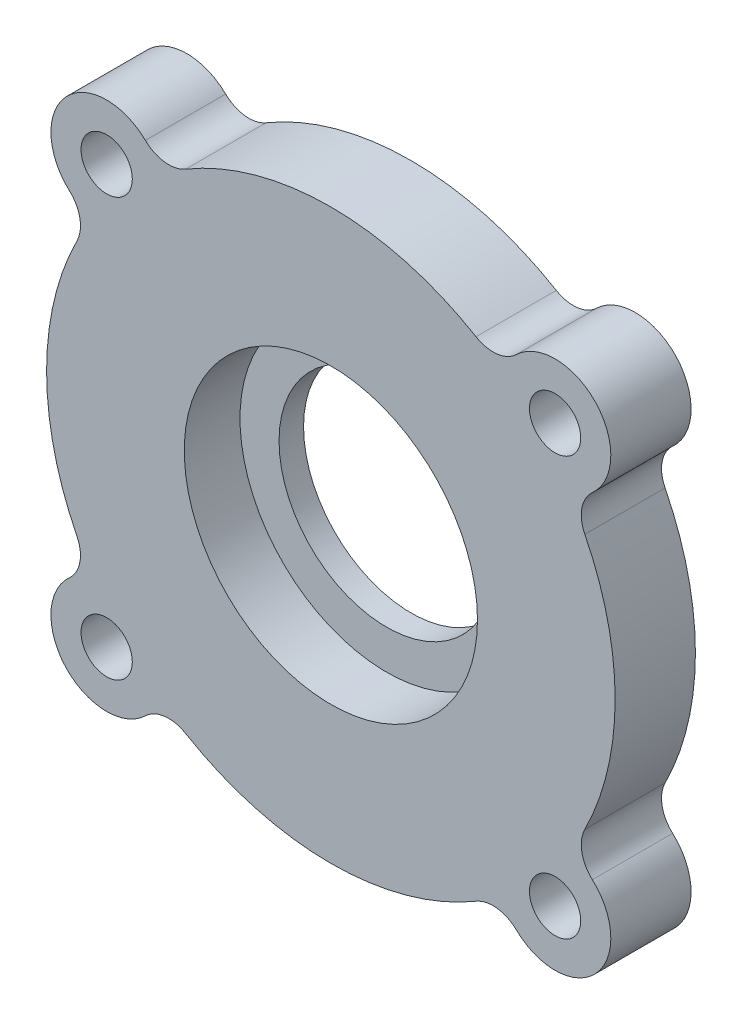
ISO-10303-21;
HEADER;
FILE_DESCRIPTION(('STEP AP214'),'2;1');
FILE_NAME('part.step','',(''),(''),'','','');
FILE_SCHEMA(('AUTOMOTIVE_DESIGN { 1 0 10303 214 1 1 1 1 }'));
ENDSEC;
DATA;
#1=APPLICATION_CONTEXT('core data for automotive mechanical design processes');
#2=APPLICATION_PROTOCOL_DEFINITION('international standard','automotive_design',2000,#1);
#3=PRODUCT_CONTEXT('',#1,'mechanical');
#4=PRODUCT('Part','Part','',(#3));
#5=PRODUCT_RELATED_PRODUCT_CATEGORY('part','',(#4));
#6=PRODUCT_DEFINITION_FORMATION('','',#4);
#7=PRODUCT_DEFINITION_CONTEXT('part definition',#1,'design');
#8=PRODUCT_DEFINITION('design','',#6,#7);
#9=PRODUCT_DEFINITION_SHAPE('','',#8);
#10=(LENGTH_UNIT() NAMED_UNIT(*) SI_UNIT(.MILLI.,.METRE.));
#11=(NAMED_UNIT(*) PLANE_ANGLE_UNIT() SI_UNIT($,.RADIAN.));
#12=(NAMED_UNIT(*) SI_UNIT($,.STERADIAN.) SOLID_ANGLE_UNIT());
#13=UNCERTAINTY_MEASURE_WITH_UNIT(LENGTH_MEASURE(1.E-05),#10,'distance_accuracy_value','');
#14=(GEOMETRIC_REPRESENTATION_CONTEXT(3) GLOBAL_UNCERTAINTY_ASSIGNED_CONTEXT((#13)) GLOBAL_UNIT_ASSIGNED_CONTEXT((#10,
#11,#12)) REPRESENTATION_CONTEXT('',''));
#15=CARTESIAN_POINT('',(0.,0.,0.));
#16=DIRECTION('',(0.,0.,1.));
#17=DIRECTION('',(1.,0.,0.));
#18=AXIS2_PLACEMENT_3D('',#15,#16,#17);
#19=CARTESIAN_POINT('',(0.,0.,7.2));
#20=DIRECTION('',(0.,0.,-1.));
#21=DIRECTION('',(-1.,0.,0.));
#22=AXIS2_PLACEMENT_3D('',#19,#20,#21);
#23=CYLINDRICAL_SURFACE('',#22,9.65);
#24=CARTESIAN_POINT('',(0.,0.,0.));
#25=DIRECTION('',(0.,0.,1.));
#26=DIRECTION('',(1.,0.,0.));
#27=AXIS2_PLACEMENT_3D('',#24,#25,#26);
#28=CIRCLE('',#27,9.65);
#29=CARTESIAN_POINT('',(9.65,0.,0.));
#30=VERTEX_POINT('',#29);
#31=EDGE_CURVE('E184',#30,#30,#28,.T.);
#32=ORIENTED_EDGE('',*,*,#31,.F.);
#33=EDGE_LOOP('',(#32));
#34=FACE_BOUND('',#33,.T.);
#35=CARTESIAN_POINT('',(0.,0.,2.2));
#36=DIRECTION('',(0.,0.,1.));
#37=DIRECTION('',(1.,0.,0.));
#38=AXIS2_PLACEMENT_3D('',#35,#36,#37);
#39=CIRCLE('',#38,9.65);
#40=CARTESIAN_POINT('',(9.65,0.,2.2));
#41=VERTEX_POINT('',#40);
#42=EDGE_CURVE('E37',#41,#41,#39,.T.);
#43=ORIENTED_EDGE('',*,*,#42,.T.);
#44=EDGE_LOOP('',(#43));
#45=FACE_BOUND('',#44,.T.);
#46=ADVANCED_FACE('F33',(#34,#45),#23,.F.);
#47=CARTESIAN_POINT('',(7.27538154217382,-12.2528087969982,7.2));
#48=DIRECTION('',(0.,0.,1.));
#49=DIRECTION('',(1.,0.,0.));
#50=AXIS2_PLACEMENT_3D('',#47,#48,#49);
#51=PLANE('',#50);
#52=CARTESIAN_POINT('',(0.,0.,7.2));
#53=DIRECTION('',(0.,0.,1.));
#54=DIRECTION('',(1.,0.,0.));
#55=AXIS2_PLACEMENT_3D('',#52,#53,#54);
#56=CIRCLE('',#55,13.15);
#57=CARTESIAN_POINT('',(13.15,0.,7.2));
#58=VERTEX_POINT('',#57);
#59=EDGE_CURVE('E457',#58,#58,#56,.T.);
#60=ORIENTED_EDGE('',*,*,#59,.F.);
#61=EDGE_LOOP('',(#60));
#62=FACE_BOUND('',#61,.T.);
#63=CARTESIAN_POINT('',(20.1122267945272,18.7549549017186,7.2));
#64=DIRECTION('',(0.,0.,1.));
#65=DIRECTION('',(1.,0.,0.));
#66=AXIS2_PLACEMENT_3D('',#63,#64,#65);
#67=CIRCLE('',#66,2.3);
#68=CARTESIAN_POINT('',(22.4122267945272,18.7549549017186,7.2));
#69=VERTEX_POINT('',#68);
#70=EDGE_CURVE('E469',#69,#69,#67,.T.);
#71=ORIENTED_EDGE('',*,*,#70,.F.);
#72=EDGE_LOOP('',(#71));
#73=FACE_BOUND('',#72,.T.);
#74=CARTESIAN_POINT('',(-20.1122267945272,-18.7549549017187,7.2));
#75=DIRECTION('',(0.,0.,1.));
#76=DIRECTION('',(1.,0.,0.));
#77=AXIS2_PLACEMENT_3D('',#74,#75,#76);
#78=CIRCLE('',#77,2.3);
#79=CARTESIAN_POINT('',(-17.8122267945272,-18.7549549017187,7.2));
#80=VERTEX_POINT('',#79);
#81=EDGE_CURVE('E481',#80,#80,#78,.T.);
#82=ORIENTED_EDGE('',*,*,#81,.F.);
#83=EDGE_LOOP('',(#82));
#84=FACE_BOUND('',#83,.T.);
#85=CARTESIAN_POINT('',(14.5507630843476,-24.5056175939964,7.2));
#86=DIRECTION('',(0.,0.,-1.));
#87=DIRECTION('',(1.,0.,0.));
#88=AXIS2_PLACEMENT_3D('',#85,#86,#87);
#89=CIRCLE('',#88,3.);
#90=CARTESIAN_POINT('',(13.019103812311,-21.9260788998915,7.2));
#91=VERTEX_POINT('',#90);
#92=CARTESIAN_POINT('',(16.636311975665,-22.3491190843922,7.2));
#93=VERTEX_POINT('',#92);
#94=EDGE_CURVE('E211',#91,#93,#89,.T.);
#95=ORIENTED_EDGE('',*,*,#94,.T.);
#96=CARTESIAN_POINT('',(20.1122267945272,-18.7549549017186,7.2));
#97=DIRECTION('',(0.,0.,1.));
#98=DIRECTION('',(1.,0.,0.));
#99=AXIS2_PLACEMENT_3D('',#96,#97,#98);
#100=CIRCLE('',#99,5.);
#101=CARTESIAN_POINT('',(23.4551682130951,-15.0367910172155,7.2));
#102=VERTEX_POINT('',#101);
#103=EDGE_CURVE('E118',#93,#102,#100,.T.);
#104=ORIENTED_EDGE('',*,*,#103,.T.);
#105=CARTESIAN_POINT('',(25.4609330642358,-12.8058926865136,7.2));
#106=DIRECTION('',(0.,0.,-1.));
#107=DIRECTION('',(1.,0.,0.));
#108=AXIS2_PLACEMENT_3D('',#105,#106,#107);
#109=CIRCLE('',#108,3.);
#110=CARTESIAN_POINT('',(22.7808348469478,-11.4579039826701,7.2));
#111=VERTEX_POINT('',#110);
#112=EDGE_CURVE('E251',#102,#111,#109,.T.);
#113=ORIENTED_EDGE('',*,*,#112,.T.);
#114=CARTESIAN_POINT('',(0.,0.,7.2));
#115=DIRECTION('',(0.,0.,1.));
#116=DIRECTION('',(1.,0.,0.));
#117=AXIS2_PLACEMENT_3D('',#114,#115,#116);
#118=CIRCLE('',#117,25.5);
#119=CARTESIAN_POINT('',(22.7808348469478,11.4579039826701,7.2));
#120=VERTEX_POINT('',#119);
#121=EDGE_CURVE('E270',#111,#120,#118,.T.);
#122=ORIENTED_EDGE('',*,*,#121,.T.);
#123=CARTESIAN_POINT('',(25.4609330642358,12.8058926865136,7.2));
#124=DIRECTION('',(0.,0.,-1.));
#125=DIRECTION('',(1.,0.,0.));
#126=AXIS2_PLACEMENT_3D('',#123,#124,#125);
#127=CIRCLE('',#126,3.);
#128=CARTESIAN_POINT('',(23.4551682130951,15.0367910172155,7.2));
#129=VERTEX_POINT('',#128);
#130=EDGE_CURVE('E267',#120,#129,#127,.T.);
#131=ORIENTED_EDGE('',*,*,#130,.T.);
#132=CARTESIAN_POINT('',(20.1122267945272,18.7549549017186,7.2));
#133=DIRECTION('',(0.,0.,1.));
#134=DIRECTION('',(1.,0.,0.));
#135=AXIS2_PLACEMENT_3D('',#132,#133,#134);
#136=CIRCLE('',#135,5.);
#137=CARTESIAN_POINT('',(16.636311975665,22.3491190843922,7.2));
#138=VERTEX_POINT('',#137);
#139=EDGE_CURVE('E269',#129,#138,#136,.T.);
#140=ORIENTED_EDGE('',*,*,#139,.T.);
#141=CARTESIAN_POINT('',(14.5507630843476,24.5056175939964,7.2));
#142=DIRECTION('',(0.,0.,-1.));
#143=DIRECTION('',(1.,0.,0.));
#144=AXIS2_PLACEMENT_3D('',#141,#142,#143);
#145=CIRCLE('',#144,3.);
#146=CARTESIAN_POINT('',(13.019103812311,21.9260788998915,7.2));
#147=VERTEX_POINT('',#146);
#148=EDGE_CURVE('E272',#138,#147,#145,.T.);
#149=ORIENTED_EDGE('',*,*,#148,.T.);
#150=CARTESIAN_POINT('',(0.,0.,7.2));
#151=DIRECTION('',(0.,0.,1.));
#152=DIRECTION('',(1.,0.,0.));
#153=AXIS2_PLACEMENT_3D('',#150,#151,#152);
#154=CIRCLE('',#153,25.5);
#155=CARTESIAN_POINT('',(-13.019103812311,21.9260788998915,7.2));
#156=VERTEX_POINT('',#155);
#157=EDGE_CURVE('E278',#147,#156,#154,.T.);
#158=ORIENTED_EDGE('',*,*,#157,.T.);
#159=CARTESIAN_POINT('',(-14.5507630843476,24.5056175939964,7.2));
#160=DIRECTION('',(0.,0.,-1.));
#161=DIRECTION('',(1.,0.,0.));
#162=AXIS2_PLACEMENT_3D('',#159,#160,#161);
#163=CIRCLE('',#162,3.);
#164=CARTESIAN_POINT('',(-16.636311975665,22.3491190843922,7.2));
#165=VERTEX_POINT('',#164);
#166=EDGE_CURVE('E280',#156,#165,#163,.T.);
#167=ORIENTED_EDGE('',*,*,#166,.T.);
#168=CARTESIAN_POINT('',(-20.1122267945272,18.7549549017187,7.2));
#169=DIRECTION('',(0.,0.,1.));
#170=DIRECTION('',(1.,0.,0.));
#171=AXIS2_PLACEMENT_3D('',#168,#169,#170);
#172=CIRCLE('',#171,5.);
#173=CARTESIAN_POINT('',(-23.4551682130951,15.0367910172155,7.2));
#174=VERTEX_POINT('',#173);
#175=EDGE_CURVE('E282',#165,#174,#172,.T.);
#176=ORIENTED_EDGE('',*,*,#175,.T.);
#177=CARTESIAN_POINT('',(-25.4609330642358,12.8058926865136,7.2));
#178=DIRECTION('',(0.,0.,-1.));
#179=DIRECTION('',(1.,0.,0.));
#180=AXIS2_PLACEMENT_3D('',#177,#178,#179);
#181=CIRCLE('',#180,3.);
#182=CARTESIAN_POINT('',(-22.7808348469478,11.4579039826701,7.2));
#183=VERTEX_POINT('',#182);
#184=EDGE_CURVE('E284',#174,#183,#181,.T.);
#185=ORIENTED_EDGE('',*,*,#184,.T.);
#186=CARTESIAN_POINT('',(0.,0.,7.2));
#187=DIRECTION('',(0.,0.,1.));
#188=DIRECTION('',(1.,0.,0.));
#189=AXIS2_PLACEMENT_3D('',#186,#187,#188);
#190=CIRCLE('',#189,25.5);
#191=CARTESIAN_POINT('',(-22.7808348469478,-11.4579039826701,7.2));
#192=VERTEX_POINT('',#191);
#193=EDGE_CURVE('E286',#183,#192,#190,.T.);
#194=ORIENTED_EDGE('',*,*,#193,.T.);
#195=CARTESIAN_POINT('',(-25.4609330642358,-12.8058926865136,7.2));
#196=DIRECTION('',(0.,0.,-1.));
#197=DIRECTION('',(1.,0.,0.));
#198=AXIS2_PLACEMENT_3D('',#195,#196,#197);
#199=CIRCLE('',#198,3.);
#200=CARTESIAN_POINT('',(-23.4551682130951,-15.0367910172155,7.2));
#201=VERTEX_POINT('',#200);
#202=EDGE_CURVE('E162',#192,#201,#199,.T.);
#203=ORIENTED_EDGE('',*,*,#202,.T.);
#204=CARTESIAN_POINT('',(-20.1122267945272,-18.7549549017187,7.2));
#205=DIRECTION('',(0.,0.,1.));
#206=DIRECTION('',(1.,0.,0.));
#207=AXIS2_PLACEMENT_3D('',#204,#205,#206);
#208=CIRCLE('',#207,5.);
#209=CARTESIAN_POINT('',(-16.636311975665,-22.3491190843922,7.2));
#210=VERTEX_POINT('',#209);
#211=EDGE_CURVE('E155',#201,#210,#208,.T.);
#212=ORIENTED_EDGE('',*,*,#211,.T.);
#213=CARTESIAN_POINT('',(-14.5507630843476,-24.5056175939964,7.2));
#214=DIRECTION('',(0.,0.,-1.));
#215=DIRECTION('',(1.,0.,0.));
#216=AXIS2_PLACEMENT_3D('',#213,#214,#215);
#217=CIRCLE('',#216,3.);
#218=CARTESIAN_POINT('',(-13.019103812311,-21.9260788998915,7.2));
#219=VERTEX_POINT('',#218);
#220=EDGE_CURVE('E160',#210,#219,#217,.T.);
#221=ORIENTED_EDGE('',*,*,#220,.T.);
#222=CARTESIAN_POINT('',(0.,0.,7.2));
#223=DIRECTION('',(0.,0.,1.));
#224=DIRECTION('',(1.,0.,0.));
#225=AXIS2_PLACEMENT_3D('',#222,#223,#224);
#226=CIRCLE('',#225,25.5);
#227=EDGE_CURVE('E51',#219,#91,#226,.T.);
#228=ORIENTED_EDGE('',*,*,#227,.T.);
#229=EDGE_LOOP('',(#95,#104,#113,#122,#131,#140,#149,#158,#167,#176,#185,#194,#203,#212,#221,#228));
#230=FACE_BOUND('',#229,.T.);
#231=CARTESIAN_POINT('',(20.1122267945272,-18.7549549017186,7.2));
#232=DIRECTION('',(0.,0.,1.));
#233=DIRECTION('',(1.,0.,0.));
#234=AXIS2_PLACEMENT_3D('',#231,#232,#233);
#235=CIRCLE('',#234,2.3);
#236=CARTESIAN_POINT('',(22.4122267945272,-18.7549549017186,7.2));
#237=VERTEX_POINT('',#236);
#238=EDGE_CURVE('E475',#237,#237,#235,.T.);
#239=ORIENTED_EDGE('',*,*,#238,.F.);
#240=EDGE_LOOP('',(#239));
#241=FACE_BOUND('',#240,.T.);
#242=CARTESIAN_POINT('',(-20.1122267945272,18.7549549017187,7.2));
#243=DIRECTION('',(0.,0.,1.));
#244=DIRECTION('',(1.,0.,0.));
#245=AXIS2_PLACEMENT_3D('',#242,#243,#244);
#246=CIRCLE('',#245,2.3);
#247=CARTESIAN_POINT('',(-17.8122267945272,18.7549549017187,7.2));
#248=VERTEX_POINT('',#247);
#249=EDGE_CURVE('E463',#248,#248,#246,.T.);
#250=ORIENTED_EDGE('',*,*,#249,.F.);
#251=EDGE_LOOP('',(#250));
#252=FACE_BOUND('',#251,.T.);
#253=ADVANCED_FACE('F157',(#62,#73,#84,#230,#241,#252),#51,.T.);
#254=CARTESIAN_POINT('',(7.27538154217382,-12.2528087969982,0.));
#255=DIRECTION('',(0.,0.,1.));
#256=DIRECTION('',(1.,0.,0.));
#257=AXIS2_PLACEMENT_3D('',#254,#255,#256);
#258=PLANE('',#257);
#259=CARTESIAN_POINT('',(14.5507630843476,-24.5056175939964,0.));
#260=DIRECTION('',(0.,0.,-1.));
#261=DIRECTION('',(1.,0.,0.));
#262=AXIS2_PLACEMENT_3D('',#259,#260,#261);
#263=CIRCLE('',#262,3.);
#264=CARTESIAN_POINT('',(13.019103812311,-21.9260788998915,0.));
#265=VERTEX_POINT('',#264);
#266=CARTESIAN_POINT('',(16.636311975665,-22.3491190843922,0.));
#267=VERTEX_POINT('',#266);
#268=EDGE_CURVE('E180',#265,#267,#263,.T.);
#269=ORIENTED_EDGE('',*,*,#268,.F.);
#270=CARTESIAN_POINT('',(0.,0.,0.));
#271=DIRECTION('',(0.,0.,1.));
#272=DIRECTION('',(1.,0.,0.));
#273=AXIS2_PLACEMENT_3D('',#270,#271,#272);
#274=CIRCLE('',#273,25.5);
#275=CARTESIAN_POINT('',(-13.019103812311,-21.9260788998915,0.));
#276=VERTEX_POINT('',#275);
#277=EDGE_CURVE('E110',#276,#265,#274,.T.);
#278=ORIENTED_EDGE('',*,*,#277,.F.);
#279=CARTESIAN_POINT('',(-14.5507630843476,-24.5056175939964,0.));
#280=DIRECTION('',(0.,0.,-1.));
#281=DIRECTION('',(1.,0.,0.));
#282=AXIS2_PLACEMENT_3D('',#279,#280,#281);
#283=CIRCLE('',#282,3.);
#284=CARTESIAN_POINT('',(-16.636311975665,-22.3491190843922,0.));
#285=VERTEX_POINT('',#284);
#286=EDGE_CURVE('E104',#285,#276,#283,.T.);
#287=ORIENTED_EDGE('',*,*,#286,.F.);
#288=CARTESIAN_POINT('',(-20.1122267945272,-18.7549549017187,0.));
#289=DIRECTION('',(0.,0.,1.));
#290=DIRECTION('',(1.,0.,0.));
#291=AXIS2_PLACEMENT_3D('',#288,#289,#290);
#292=CIRCLE('',#291,5.);
#293=CARTESIAN_POINT('',(-23.4551682130951,-15.0367910172155,0.));
#294=VERTEX_POINT('',#293);
#295=EDGE_CURVE('E170',#294,#285,#292,.T.);
#296=ORIENTED_EDGE('',*,*,#295,.F.);
#297=CARTESIAN_POINT('',(-25.4609330642358,-12.8058926865136,0.));
#298=DIRECTION('',(0.,0.,-1.));
#299=DIRECTION('',(1.,0.,0.));
#300=AXIS2_PLACEMENT_3D('',#297,#298,#299);
#301=CIRCLE('',#300,3.);
#302=CARTESIAN_POINT('',(-22.7808348469478,-11.4579039826701,0.));
#303=VERTEX_POINT('',#302);
#304=EDGE_CURVE('E206',#303,#294,#301,.T.);
#305=ORIENTED_EDGE('',*,*,#304,.F.);
#306=CARTESIAN_POINT('',(0.,0.,0.));
#307=DIRECTION('',(0.,0.,1.));
#308=DIRECTION('',(1.,0.,0.));
#309=AXIS2_PLACEMENT_3D('',#306,#307,#308);
#310=CIRCLE('',#309,25.5);
#311=CARTESIAN_POINT('',(-22.7808348469478,11.4579039826701,0.));
#312=VERTEX_POINT('',#311);
#313=EDGE_CURVE('E204',#312,#303,#310,.T.);
#314=ORIENTED_EDGE('',*,*,#313,.F.);
#315=CARTESIAN_POINT('',(-25.4609330642358,12.8058926865136,0.));
#316=DIRECTION('',(0.,0.,-1.));
#317=DIRECTION('',(1.,0.,0.));
#318=AXIS2_PLACEMENT_3D('',#315,#316,#317);
#319=CIRCLE('',#318,3.);
#320=CARTESIAN_POINT('',(-23.4551682130951,15.0367910172155,0.));
#321=VERTEX_POINT('',#320);
#322=EDGE_CURVE('E202',#321,#312,#319,.T.);
#323=ORIENTED_EDGE('',*,*,#322,.F.);
#324=CARTESIAN_POINT('',(-20.1122267945272,18.7549549017187,0.));
#325=DIRECTION('',(0.,0.,1.));
#326=DIRECTION('',(1.,0.,0.));
#327=AXIS2_PLACEMENT_3D('',#324,#325,#326);
#328=CIRCLE('',#327,5.);
#329=CARTESIAN_POINT('',(-16.636311975665,22.3491190843922,0.));
#330=VERTEX_POINT('',#329);
#331=EDGE_CURVE('E200',#330,#321,#328,.T.);
#332=ORIENTED_EDGE('',*,*,#331,.F.);
#333=CARTESIAN_POINT('',(-14.5507630843476,24.5056175939964,0.));
#334=DIRECTION('',(0.,0.,-1.));
#335=DIRECTION('',(1.,0.,0.));
#336=AXIS2_PLACEMENT_3D('',#333,#334,#335);
#337=CIRCLE('',#336,3.);
#338=CARTESIAN_POINT('',(-13.019103812311,21.9260788998915,0.));
#339=VERTEX_POINT('',#338);
#340=EDGE_CURVE('E198',#339,#330,#337,.T.);
#341=ORIENTED_EDGE('',*,*,#340,.F.);
#342=CARTESIAN_POINT('',(0.,0.,0.));
#343=DIRECTION('',(0.,0.,1.));
#344=DIRECTION('',(1.,0.,0.));
#345=AXIS2_PLACEMENT_3D('',#342,#343,#344);
#346=CIRCLE('',#345,25.5);
#347=CARTESIAN_POINT('',(13.019103812311,21.9260788998915,0.));
#348=VERTEX_POINT('',#347);
#349=EDGE_CURVE('E196',#348,#339,#346,.T.);
#350=ORIENTED_EDGE('',*,*,#349,.F.);
#351=CARTESIAN_POINT('',(14.5507630843476,24.5056175939964,0.));
#352=DIRECTION('',(0.,0.,-1.));
#353=DIRECTION('',(1.,0.,0.));
#354=AXIS2_PLACEMENT_3D('',#351,#352,#353);
#355=CIRCLE('',#354,3.);
#356=CARTESIAN_POINT('',(16.636311975665,22.3491190843922,0.));
#357=VERTEX_POINT('',#356);
#358=EDGE_CURVE('E194',#357,#348,#355,.T.);
#359=ORIENTED_EDGE('',*,*,#358,.F.);
#360=CARTESIAN_POINT('',(20.1122267945272,18.7549549017186,0.));
#361=DIRECTION('',(0.,0.,1.));
#362=DIRECTION('',(1.,0.,0.));
#363=AXIS2_PLACEMENT_3D('',#360,#361,#362);
#364=CIRCLE('',#363,5.);
#365=CARTESIAN_POINT('',(23.4551682130951,15.0367910172155,0.));
#366=VERTEX_POINT('',#365);
#367=EDGE_CURVE('E192',#366,#357,#364,.T.);
#368=ORIENTED_EDGE('',*,*,#367,.F.);
#369=CARTESIAN_POINT('',(25.4609330642358,12.8058926865136,0.));
#370=DIRECTION('',(0.,0.,-1.));
#371=DIRECTION('',(1.,0.,0.));
#372=AXIS2_PLACEMENT_3D('',#369,#370,#371);
#373=CIRCLE('',#372,3.);
#374=CARTESIAN_POINT('',(22.7808348469478,11.4579039826701,0.));
#375=VERTEX_POINT('',#374);
#376=EDGE_CURVE('E190',#375,#366,#373,.T.);
#377=ORIENTED_EDGE('',*,*,#376,.F.);
#378=CARTESIAN_POINT('',(0.,0.,0.));
#379=DIRECTION('',(0.,0.,1.));
#380=DIRECTION('',(1.,0.,0.));
#381=AXIS2_PLACEMENT_3D('',#378,#379,#380);
#382=CIRCLE('',#381,25.5);
#383=CARTESIAN_POINT('',(22.7808348469478,-11.4579039826701,0.));
#384=VERTEX_POINT('',#383);
#385=EDGE_CURVE('E188',#384,#375,#382,.T.);
#386=ORIENTED_EDGE('',*,*,#385,.F.);
#387=CARTESIAN_POINT('',(25.4609330642358,-12.8058926865136,0.));
#388=DIRECTION('',(0.,0.,-1.));
#389=DIRECTION('',(1.,0.,0.));
#390=AXIS2_PLACEMENT_3D('',#387,#388,#389);
#391=CIRCLE('',#390,3.);
#392=CARTESIAN_POINT('',(23.4551682130951,-15.0367910172155,0.));
#393=VERTEX_POINT('',#392);
#394=EDGE_CURVE('E186',#393,#384,#391,.T.);
#395=ORIENTED_EDGE('',*,*,#394,.F.);
#396=CARTESIAN_POINT('',(20.1122267945272,-18.7549549017186,0.));
#397=DIRECTION('',(0.,0.,1.));
#398=DIRECTION('',(1.,0.,0.));
#399=AXIS2_PLACEMENT_3D('',#396,#397,#398);
#400=CIRCLE('',#399,5.);
#401=EDGE_CURVE('E183',#267,#393,#400,.T.);
#402=ORIENTED_EDGE('',*,*,#401,.F.);
#403=EDGE_LOOP('',(#269,#278,#287,#296,#305,#314,#323,#332,#341,#350,#359,#368,#377,#386,#395,#402));
#404=FACE_BOUND('',#403,.T.);
#405=ORIENTED_EDGE('',*,*,#31,.T.);
#406=EDGE_LOOP('',(#405));
#407=FACE_BOUND('',#406,.T.);
#408=CARTESIAN_POINT('',(-20.1122267945272,-18.7549549017187,0.));
#409=DIRECTION('',(0.,0.,1.));
#410=DIRECTION('',(1.,0.,0.));
#411=AXIS2_PLACEMENT_3D('',#408,#409,#410);
#412=CIRCLE('',#411,2.3);
#413=CARTESIAN_POINT('',(-17.8122267945272,-18.7549549017187,0.));
#414=VERTEX_POINT('',#413);
#415=EDGE_CURVE('E478',#414,#414,#412,.T.);
#416=ORIENTED_EDGE('',*,*,#415,.T.);
#417=EDGE_LOOP('',(#416));
#418=FACE_BOUND('',#417,.T.);
#419=CARTESIAN_POINT('',(20.1122267945272,-18.7549549017186,0.));
#420=DIRECTION('',(0.,0.,1.));
#421=DIRECTION('',(1.,0.,0.));
#422=AXIS2_PLACEMENT_3D('',#419,#420,#421);
#423=CIRCLE('',#422,2.3);
#424=CARTESIAN_POINT('',(22.4122267945272,-18.7549549017186,0.));
#425=VERTEX_POINT('',#424);
#426=EDGE_CURVE('E472',#425,#425,#423,.T.);
#427=ORIENTED_EDGE('',*,*,#426,.T.);
#428=EDGE_LOOP('',(#427));
#429=FACE_BOUND('',#428,.T.);
#430=CARTESIAN_POINT('',(20.1122267945272,18.7549549017186,0.));
#431=DIRECTION('',(0.,0.,1.));
#432=DIRECTION('',(1.,0.,0.));
#433=AXIS2_PLACEMENT_3D('',#430,#431,#432);
#434=CIRCLE('',#433,2.3);
#435=CARTESIAN_POINT('',(22.4122267945272,18.7549549017186,0.));
#436=VERTEX_POINT('',#435);
#437=EDGE_CURVE('E466',#436,#436,#434,.T.);
#438=ORIENTED_EDGE('',*,*,#437,.T.);
#439=EDGE_LOOP('',(#438));
#440=FACE_BOUND('',#439,.T.);
#441=CARTESIAN_POINT('',(-20.1122267945272,18.7549549017187,0.));
#442=DIRECTION('',(0.,0.,1.));
#443=DIRECTION('',(1.,0.,0.));
#444=AXIS2_PLACEMENT_3D('',#441,#442,#443);
#445=CIRCLE('',#444,2.3);
#446=CARTESIAN_POINT('',(-17.8122267945272,18.7549549017187,0.));
#447=VERTEX_POINT('',#446);
#448=EDGE_CURVE('E459',#447,#447,#445,.T.);
#449=ORIENTED_EDGE('',*,*,#448,.T.);
#450=EDGE_LOOP('',(#449));
#451=FACE_BOUND('',#450,.T.);
#452=ADVANCED_FACE('F255',(#404,#407,#418,#429,#440,#451),#258,.F.);
#453=CARTESIAN_POINT('',(14.5507630843476,-24.5056175939964,7.2));
#454=DIRECTION('',(0.,0.,-1.));
#455=DIRECTION('',(-1.,0.,0.));
#456=AXIS2_PLACEMENT_3D('',#453,#454,#455);
#457=CYLINDRICAL_SURFACE('',#456,3.);
#458=ORIENTED_EDGE('',*,*,#268,.T.);
#459=DIRECTION('',(0.,0.,-1.));
#460=VECTOR('',#459,1.);
#461=CARTESIAN_POINT('',(16.636311975665,-22.3491190843922,7.2));
#462=LINE('',#461,#460);
#463=EDGE_CURVE('E11',#93,#267,#462,.T.);
#464=ORIENTED_EDGE('',*,*,#463,.F.);
#465=ORIENTED_EDGE('',*,*,#94,.F.);
#466=DIRECTION('',(0.,0.,-1.));
#467=VECTOR('',#466,1.);
#468=CARTESIAN_POINT('',(13.019103812311,-21.9260788998915,7.2));
#469=LINE('',#468,#467);
#470=EDGE_CURVE('E176',#91,#265,#469,.T.);
#471=ORIENTED_EDGE('',*,*,#470,.T.);
#472=EDGE_LOOP('',(#458,#464,#465,#471));
#473=FACE_BOUND('',#472,.T.);
#474=ADVANCED_FACE('F35',(#473),#457,.F.);
#475=CARTESIAN_POINT('',(20.1122267945272,-18.7549549017186,7.2));
#476=DIRECTION('',(0.,0.,-1.));
#477=DIRECTION('',(-1.,0.,0.));
#478=AXIS2_PLACEMENT_3D('',#475,#476,#477);
#479=CYLINDRICAL_SURFACE('',#478,5.);
#480=ORIENTED_EDGE('',*,*,#401,.T.);
#481=DIRECTION('',(0.,0.,-1.));
#482=VECTOR('',#481,1.);
#483=CARTESIAN_POINT('',(23.4551682130951,-15.0367910172155,7.2));
#484=LINE('',#483,#482);
#485=EDGE_CURVE('E43',#102,#393,#484,.T.);
#486=ORIENTED_EDGE('',*,*,#485,.F.);
#487=ORIENTED_EDGE('',*,*,#103,.F.);
#488=ORIENTED_EDGE('',*,*,#463,.T.);
#489=EDGE_LOOP('',(#480,#486,#487,#488));
#490=FACE_BOUND('',#489,.T.);
#491=ADVANCED_FACE('F328',(#490),#479,.T.);
#492=CARTESIAN_POINT('',(25.4609330642358,-12.8058926865136,7.2));
#493=DIRECTION('',(0.,0.,-1.));
#494=DIRECTION('',(-1.,0.,0.));
#495=AXIS2_PLACEMENT_3D('',#492,#493,#494);
#496=CYLINDRICAL_SURFACE('',#495,3.);
#497=ORIENTED_EDGE('',*,*,#394,.T.);
#498=DIRECTION('',(0.,0.,-1.));
#499=VECTOR('',#498,1.);
#500=CARTESIAN_POINT('',(22.7808348469478,-11.4579039826701,7.2));
#501=LINE('',#500,#499);
#502=EDGE_CURVE('E242',#111,#384,#501,.T.);
#503=ORIENTED_EDGE('',*,*,#502,.F.);
#504=ORIENTED_EDGE('',*,*,#112,.F.);
#505=ORIENTED_EDGE('',*,*,#485,.T.);
#506=EDGE_LOOP('',(#497,#503,#504,#505));
#507=FACE_BOUND('',#506,.T.);
#508=ADVANCED_FACE('F249',(#507),#496,.F.);
#509=CARTESIAN_POINT('',(0.,0.,7.2));
#510=DIRECTION('',(0.,0.,-1.));
#511=DIRECTION('',(-1.,0.,0.));
#512=AXIS2_PLACEMENT_3D('',#509,#510,#511);
#513=CYLINDRICAL_SURFACE('',#512,25.5);
#514=ORIENTED_EDGE('',*,*,#385,.T.);
#515=DIRECTION('',(0.,0.,-1.));
#516=VECTOR('',#515,1.);
#517=CARTESIAN_POINT('',(22.7808348469478,11.4579039826701,7.2));
#518=LINE('',#517,#516);
#519=EDGE_CURVE('E239',#120,#375,#518,.T.);
#520=ORIENTED_EDGE('',*,*,#519,.F.);
#521=ORIENTED_EDGE('',*,*,#121,.F.);
#522=ORIENTED_EDGE('',*,*,#502,.T.);
#523=EDGE_LOOP('',(#514,#520,#521,#522));
#524=FACE_BOUND('',#523,.T.);
#525=ADVANCED_FACE('F261',(#524),#513,.T.);
#526=CARTESIAN_POINT('',(25.4609330642358,12.8058926865136,7.2));
#527=DIRECTION('',(0.,0.,-1.));
#528=DIRECTION('',(-1.,0.,0.));
#529=AXIS2_PLACEMENT_3D('',#526,#527,#528);
#530=CYLINDRICAL_SURFACE('',#529,3.);
#531=ORIENTED_EDGE('',*,*,#376,.T.);
#532=DIRECTION('',(0.,0.,-1.));
#533=VECTOR('',#532,1.);
#534=CARTESIAN_POINT('',(23.4551682130951,15.0367910172155,7.2));
#535=LINE('',#534,#533);
#536=EDGE_CURVE('E236',#129,#366,#535,.T.);
#537=ORIENTED_EDGE('',*,*,#536,.F.);
#538=ORIENTED_EDGE('',*,*,#130,.F.);
#539=ORIENTED_EDGE('',*,*,#519,.T.);
#540=EDGE_LOOP('',(#531,#537,#538,#539));
#541=FACE_BOUND('',#540,.T.);
#542=ADVANCED_FACE('F265',(#541),#530,.F.);
#543=CARTESIAN_POINT('',(20.1122267945272,18.7549549017186,7.2));
#544=DIRECTION('',(0.,0.,-1.));
#545=DIRECTION('',(-1.,0.,0.));
#546=AXIS2_PLACEMENT_3D('',#543,#544,#545);
#547=CYLINDRICAL_SURFACE('',#546,5.);
#548=ORIENTED_EDGE('',*,*,#367,.T.);
#549=DIRECTION('',(0.,0.,-1.));
#550=VECTOR('',#549,1.);
#551=CARTESIAN_POINT('',(16.636311975665,22.3491190843922,7.2));
#552=LINE('',#551,#550);
#553=EDGE_CURVE('E233',#138,#357,#552,.T.);
#554=ORIENTED_EDGE('',*,*,#553,.F.);
#555=ORIENTED_EDGE('',*,*,#139,.F.);
#556=ORIENTED_EDGE('',*,*,#536,.T.);
#557=EDGE_LOOP('',(#548,#554,#555,#556));
#558=FACE_BOUND('',#557,.T.);
#559=ADVANCED_FACE('F341',(#558),#547,.T.);
#560=CARTESIAN_POINT('',(14.5507630843476,24.5056175939964,7.2));
#561=DIRECTION('',(0.,0.,-1.));
#562=DIRECTION('',(-1.,0.,0.));
#563=AXIS2_PLACEMENT_3D('',#560,#561,#562);
#564=CYLINDRICAL_SURFACE('',#563,3.);
#565=ORIENTED_EDGE('',*,*,#358,.T.);
#566=DIRECTION('',(0.,0.,-1.));
#567=VECTOR('',#566,1.);
#568=CARTESIAN_POINT('',(13.019103812311,21.9260788998915,7.2));
#569=LINE('',#568,#567);
#570=EDGE_CURVE('E230',#147,#348,#569,.T.);
#571=ORIENTED_EDGE('',*,*,#570,.F.);
#572=ORIENTED_EDGE('',*,*,#148,.F.);
#573=ORIENTED_EDGE('',*,*,#553,.T.);
#574=EDGE_LOOP('',(#565,#571,#572,#573));
#575=FACE_BOUND('',#574,.T.);
#576=ADVANCED_FACE('F344',(#575),#564,.F.);
#577=CARTESIAN_POINT('',(0.,0.,7.2));
#578=DIRECTION('',(0.,0.,-1.));
#579=DIRECTION('',(-1.,0.,0.));
#580=AXIS2_PLACEMENT_3D('',#577,#578,#579);
#581=CYLINDRICAL_SURFACE('',#580,25.5);
#582=ORIENTED_EDGE('',*,*,#349,.T.);
#583=DIRECTION('',(0.,0.,-1.));
#584=VECTOR('',#583,1.);
#585=CARTESIAN_POINT('',(-13.019103812311,21.9260788998915,7.2));
#586=LINE('',#585,#584);
#587=EDGE_CURVE('E227',#156,#339,#586,.T.);
#588=ORIENTED_EDGE('',*,*,#587,.F.);
#589=ORIENTED_EDGE('',*,*,#157,.F.);
#590=ORIENTED_EDGE('',*,*,#570,.T.);
#591=EDGE_LOOP('',(#582,#588,#589,#590));
#592=FACE_BOUND('',#591,.T.);
#593=ADVANCED_FACE('F348',(#592),#581,.T.);
#594=CARTESIAN_POINT('',(-14.5507630843476,24.5056175939964,7.2));
#595=DIRECTION('',(0.,0.,-1.));
#596=DIRECTION('',(-1.,0.,0.));
#597=AXIS2_PLACEMENT_3D('',#594,#595,#596);
#598=CYLINDRICAL_SURFACE('',#597,3.);
#599=ORIENTED_EDGE('',*,*,#340,.T.);
#600=DIRECTION('',(0.,0.,-1.));
#601=VECTOR('',#600,1.);
#602=CARTESIAN_POINT('',(-16.636311975665,22.3491190843922,7.2));
#603=LINE('',#602,#601);
#604=EDGE_CURVE('E224',#165,#330,#603,.T.);
#605=ORIENTED_EDGE('',*,*,#604,.F.);
#606=ORIENTED_EDGE('',*,*,#166,.F.);
#607=ORIENTED_EDGE('',*,*,#587,.T.);
#608=EDGE_LOOP('',(#599,#605,#606,#607));
#609=FACE_BOUND('',#608,.T.);
#610=ADVANCED_FACE('F352',(#609),#598,.F.);
#611=CARTESIAN_POINT('',(-20.1122267945272,18.7549549017187,7.2));
#612=DIRECTION('',(0.,0.,-1.));
#613=DIRECTION('',(-1.,0.,0.));
#614=AXIS2_PLACEMENT_3D('',#611,#612,#613);
#615=CYLINDRICAL_SURFACE('',#614,5.);
#616=ORIENTED_EDGE('',*,*,#331,.T.);
#617=DIRECTION('',(0.,0.,-1.));
#618=VECTOR('',#617,1.);
#619=CARTESIAN_POINT('',(-23.4551682130951,15.0367910172155,7.2));
#620=LINE('',#619,#618);
#621=EDGE_CURVE('E221',#174,#321,#620,.T.);
#622=ORIENTED_EDGE('',*,*,#621,.F.);
#623=ORIENTED_EDGE('',*,*,#175,.F.);
#624=ORIENTED_EDGE('',*,*,#604,.T.);
#625=EDGE_LOOP('',(#616,#622,#623,#624));
#626=FACE_BOUND('',#625,.T.);
#627=ADVANCED_FACE('F356',(#626),#615,.T.);
#628=CARTESIAN_POINT('',(-25.4609330642358,12.8058926865136,7.2));
#629=DIRECTION('',(0.,0.,-1.));
#630=DIRECTION('',(-1.,0.,0.));
#631=AXIS2_PLACEMENT_3D('',#628,#629,#630);
#632=CYLINDRICAL_SURFACE('',#631,3.);
#633=ORIENTED_EDGE('',*,*,#322,.T.);
#634=DIRECTION('',(0.,0.,-1.));
#635=VECTOR('',#634,1.);
#636=CARTESIAN_POINT('',(-22.7808348469478,11.4579039826701,7.2));
#637=LINE('',#636,#635);
#638=EDGE_CURVE('E218',#183,#312,#637,.T.);
#639=ORIENTED_EDGE('',*,*,#638,.F.);
#640=ORIENTED_EDGE('',*,*,#184,.F.);
#641=ORIENTED_EDGE('',*,*,#621,.T.);
#642=EDGE_LOOP('',(#633,#639,#640,#641));
#643=FACE_BOUND('',#642,.T.);
#644=ADVANCED_FACE('F360',(#643),#632,.F.);
#645=CARTESIAN_POINT('',(0.,0.,7.2));
#646=DIRECTION('',(0.,0.,-1.));
#647=DIRECTION('',(-1.,0.,0.));
#648=AXIS2_PLACEMENT_3D('',#645,#646,#647);
#649=CYLINDRICAL_SURFACE('',#648,25.5);
#650=ORIENTED_EDGE('',*,*,#313,.T.);
#651=DIRECTION('',(0.,0.,-1.));
#652=VECTOR('',#651,1.);
#653=CARTESIAN_POINT('',(-22.7808348469478,-11.4579039826701,7.2));
#654=LINE('',#653,#652);
#655=EDGE_CURVE('E215',#192,#303,#654,.T.);
#656=ORIENTED_EDGE('',*,*,#655,.F.);
#657=ORIENTED_EDGE('',*,*,#193,.F.);
#658=ORIENTED_EDGE('',*,*,#638,.T.);
#659=EDGE_LOOP('',(#650,#656,#657,#658));
#660=FACE_BOUND('',#659,.T.);
#661=ADVANCED_FACE('F292',(#660),#649,.T.);
#662=CARTESIAN_POINT('',(-25.4609330642358,-12.8058926865136,7.2));
#663=DIRECTION('',(0.,0.,-1.));
#664=DIRECTION('',(-1.,0.,0.));
#665=AXIS2_PLACEMENT_3D('',#662,#663,#664);
#666=CYLINDRICAL_SURFACE('',#665,3.);
#667=ORIENTED_EDGE('',*,*,#304,.T.);
#668=DIRECTION('',(0.,0.,-1.));
#669=VECTOR('',#668,1.);
#670=CARTESIAN_POINT('',(-23.4551682130951,-15.0367910172155,7.2));
#671=LINE('',#670,#669);
#672=EDGE_CURVE('E171',#201,#294,#671,.T.);
#673=ORIENTED_EDGE('',*,*,#672,.F.);
#674=ORIENTED_EDGE('',*,*,#202,.F.);
#675=ORIENTED_EDGE('',*,*,#655,.T.);
#676=EDGE_LOOP('',(#667,#673,#674,#675));
#677=FACE_BOUND('',#676,.T.);
#678=ADVANCED_FACE('F296',(#677),#666,.F.);
#679=CARTESIAN_POINT('',(-20.1122267945272,-18.7549549017187,7.2));
#680=DIRECTION('',(0.,0.,-1.));
#681=DIRECTION('',(-1.,0.,0.));
#682=AXIS2_PLACEMENT_3D('',#679,#680,#681);
#683=CYLINDRICAL_SURFACE('',#682,5.);
#684=ORIENTED_EDGE('',*,*,#295,.T.);
#685=DIRECTION('',(0.,0.,-1.));
#686=VECTOR('',#685,1.);
#687=CARTESIAN_POINT('',(-16.636311975665,-22.3491190843922,7.2));
#688=LINE('',#687,#686);
#689=EDGE_CURVE('E167',#210,#285,#688,.T.);
#690=ORIENTED_EDGE('',*,*,#689,.F.);
#691=ORIENTED_EDGE('',*,*,#211,.F.);
#692=ORIENTED_EDGE('',*,*,#672,.T.);
#693=EDGE_LOOP('',(#684,#690,#691,#692));
#694=FACE_BOUND('',#693,.T.);
#695=ADVANCED_FACE('F168',(#694),#683,.T.);
#696=CARTESIAN_POINT('',(-14.5507630843476,-24.5056175939964,7.2));
#697=DIRECTION('',(0.,0.,-1.));
#698=DIRECTION('',(-1.,0.,0.));
#699=AXIS2_PLACEMENT_3D('',#696,#697,#698);
#700=CYLINDRICAL_SURFACE('',#699,3.);
#701=ORIENTED_EDGE('',*,*,#286,.T.);
#702=DIRECTION('',(0.,0.,-1.));
#703=VECTOR('',#702,1.);
#704=CARTESIAN_POINT('',(-13.019103812311,-21.9260788998915,7.2));
#705=LINE('',#704,#703);
#706=EDGE_CURVE('E172',#219,#276,#705,.T.);
#707=ORIENTED_EDGE('',*,*,#706,.F.);
#708=ORIENTED_EDGE('',*,*,#220,.F.);
#709=ORIENTED_EDGE('',*,*,#689,.T.);
#710=EDGE_LOOP('',(#701,#707,#708,#709));
#711=FACE_BOUND('',#710,.T.);
#712=ADVANCED_FACE('F174',(#711),#700,.F.);
#713=CARTESIAN_POINT('',(0.,0.,7.2));
#714=DIRECTION('',(0.,0.,-1.));
#715=DIRECTION('',(-1.,0.,0.));
#716=AXIS2_PLACEMENT_3D('',#713,#714,#715);
#717=CYLINDRICAL_SURFACE('',#716,25.5);
#718=ORIENTED_EDGE('',*,*,#277,.T.);
#719=ORIENTED_EDGE('',*,*,#470,.F.);
#720=ORIENTED_EDGE('',*,*,#227,.F.);
#721=ORIENTED_EDGE('',*,*,#706,.T.);
#722=EDGE_LOOP('',(#718,#719,#720,#721));
#723=FACE_BOUND('',#722,.T.);
#724=ADVANCED_FACE('F300',(#723),#717,.T.);
#725=CARTESIAN_POINT('',(-20.1122267945272,-18.7549549017187,7.2));
#726=DIRECTION('',(0.,0.,-1.));
#727=DIRECTION('',(-1.,0.,0.));
#728=AXIS2_PLACEMENT_3D('',#725,#726,#727);
#729=CYLINDRICAL_SURFACE('',#728,2.3);
#730=ORIENTED_EDGE('',*,*,#81,.T.);
#731=EDGE_LOOP('',(#730));
#732=FACE_BOUND('',#731,.T.);
#733=ORIENTED_EDGE('',*,*,#415,.F.);
#734=EDGE_LOOP('',(#733));
#735=FACE_BOUND('',#734,.T.);
#736=ADVANCED_FACE('F302',(#732,#735),#729,.F.);
#737=CARTESIAN_POINT('',(20.1122267945272,-18.7549549017186,7.2));
#738=DIRECTION('',(0.,0.,-1.));
#739=DIRECTION('',(-1.,0.,0.));
#740=AXIS2_PLACEMENT_3D('',#737,#738,#739);
#741=CYLINDRICAL_SURFACE('',#740,2.3);
#742=ORIENTED_EDGE('',*,*,#238,.T.);
#743=EDGE_LOOP('',(#742));
#744=FACE_BOUND('',#743,.T.);
#745=ORIENTED_EDGE('',*,*,#426,.F.);
#746=EDGE_LOOP('',(#745));
#747=FACE_BOUND('',#746,.T.);
#748=ADVANCED_FACE('F308',(#744,#747),#741,.F.);
#749=CARTESIAN_POINT('',(20.1122267945272,18.7549549017186,7.2));
#750=DIRECTION('',(0.,0.,-1.));
#751=DIRECTION('',(-1.,0.,0.));
#752=AXIS2_PLACEMENT_3D('',#749,#750,#751);
#753=CYLINDRICAL_SURFACE('',#752,2.3);
#754=ORIENTED_EDGE('',*,*,#70,.T.);
#755=EDGE_LOOP('',(#754));
#756=FACE_BOUND('',#755,.T.);
#757=ORIENTED_EDGE('',*,*,#437,.F.);
#758=EDGE_LOOP('',(#757));
#759=FACE_BOUND('',#758,.T.);
#760=ADVANCED_FACE('F397',(#756,#759),#753,.F.);
#761=CARTESIAN_POINT('',(-20.1122267945272,18.7549549017187,7.2));
#762=DIRECTION('',(0.,0.,-1.));
#763=DIRECTION('',(-1.,0.,0.));
#764=AXIS2_PLACEMENT_3D('',#761,#762,#763);
#765=CYLINDRICAL_SURFACE('',#764,2.3);
#766=ORIENTED_EDGE('',*,*,#249,.T.);
#767=EDGE_LOOP('',(#766));
#768=FACE_BOUND('',#767,.T.);
#769=ORIENTED_EDGE('',*,*,#448,.F.);
#770=EDGE_LOOP('',(#769));
#771=FACE_BOUND('',#770,.T.);
#772=ADVANCED_FACE('F406',(#768,#771),#765,.F.);
#773=CARTESIAN_POINT('',(0.,0.,2.2));
#774=DIRECTION('',(0.,0.,1.));
#775=DIRECTION('',(1.,0.,0.));
#776=AXIS2_PLACEMENT_3D('',#773,#774,#775);
#777=CYLINDRICAL_SURFACE('',#776,13.15);
#778=CARTESIAN_POINT('',(0.,0.,2.2));
#779=DIRECTION('',(0.,0.,1.));
#780=DIRECTION('',(1.,0.,0.));
#781=AXIS2_PLACEMENT_3D('',#778,#779,#780);
#782=CIRCLE('',#781,13.15);
#783=CARTESIAN_POINT('',(13.15,0.,2.2));
#784=VERTEX_POINT('',#783);
#785=EDGE_CURVE('E456',#784,#784,#782,.T.);
#786=ORIENTED_EDGE('',*,*,#785,.F.);
#787=EDGE_LOOP('',(#786));
#788=FACE_BOUND('',#787,.T.);
#789=ORIENTED_EDGE('',*,*,#59,.T.);
#790=EDGE_LOOP('',(#789));
#791=FACE_BOUND('',#790,.T.);
#792=ADVANCED_FACE('F415',(#788,#791),#777,.F.);
#793=CARTESIAN_POINT('',(0.,0.,2.2));
#794=DIRECTION('',(0.,0.,1.));
#795=DIRECTION('',(1.,0.,0.));
#796=AXIS2_PLACEMENT_3D('',#793,#794,#795);
#797=PLANE('',#796);
#798=ORIENTED_EDGE('',*,*,#42,.F.);
#799=EDGE_LOOP('',(#798));
#800=FACE_BOUND('',#799,.T.);
#801=ORIENTED_EDGE('',*,*,#785,.T.);
#802=EDGE_LOOP('',(#801));
#803=FACE_BOUND('',#802,.T.);
#804=ADVANCED_FACE('F437',(#800,#803),#797,.T.);
#805=CLOSED_SHELL('',(#46,#253,#452,#474,#491,#508,#525,#542,#559,#576,#593,#610,#627,#644,#661,
#678,#695,#712,#724,#736,#748,#760,#772,#792,#804));
#806=MANIFOLD_SOLID_BREP('B2',#805);
#807=ADVANCED_BREP_SHAPE_REPRESENTATION('',(#18,#806),#14);
#808=SHAPE_DEFINITION_REPRESENTATION(#9,#807);
ENDSEC;
END-ISO-10303-21;
